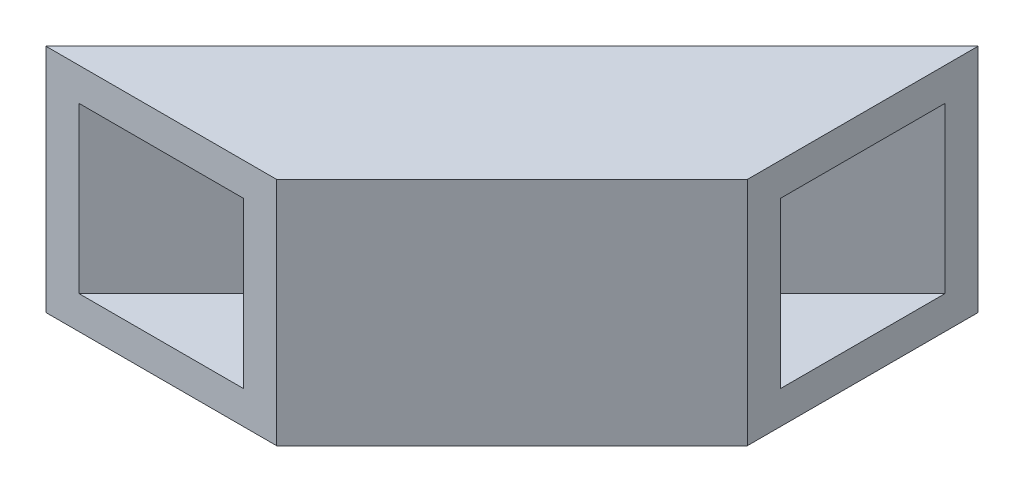
ISO-10303-21;
HEADER;
FILE_DESCRIPTION(('STEP AP214'),'2;1');
FILE_NAME('part.step','',(''),(''),'','','');
FILE_SCHEMA(('AUTOMOTIVE_DESIGN { 1 0 10303 214 1 1 1 1 }'));
ENDSEC;
DATA;
#1=APPLICATION_CONTEXT('core data for automotive mechanical design processes');
#2=APPLICATION_PROTOCOL_DEFINITION('international standard','automotive_design',2000,#1);
#3=PRODUCT_CONTEXT('',#1,'mechanical');
#4=PRODUCT('Part','Part','',(#3));
#5=PRODUCT_RELATED_PRODUCT_CATEGORY('part','',(#4));
#6=PRODUCT_DEFINITION_FORMATION('','',#4);
#7=PRODUCT_DEFINITION_CONTEXT('part definition',#1,'design');
#8=PRODUCT_DEFINITION('design','',#6,#7);
#9=PRODUCT_DEFINITION_SHAPE('','',#8);
#10=(LENGTH_UNIT() NAMED_UNIT(*) SI_UNIT(.MILLI.,.METRE.));
#11=(NAMED_UNIT(*) PLANE_ANGLE_UNIT() SI_UNIT($,.RADIAN.));
#12=(NAMED_UNIT(*) SI_UNIT($,.STERADIAN.) SOLID_ANGLE_UNIT());
#13=UNCERTAINTY_MEASURE_WITH_UNIT(LENGTH_MEASURE(1.E-05),#10,'distance_accuracy_value','');
#14=(GEOMETRIC_REPRESENTATION_CONTEXT(3) GLOBAL_UNCERTAINTY_ASSIGNED_CONTEXT((#13)) GLOBAL_UNIT_ASSIGNED_CONTEXT((#10,
#11,#12)) REPRESENTATION_CONTEXT('',''));
#15=CARTESIAN_POINT('',(0.,0.,0.));
#16=DIRECTION('',(0.,0.,1.));
#17=DIRECTION('',(1.,0.,0.));
#18=AXIS2_PLACEMENT_3D('',#15,#16,#17);
#19=CARTESIAN_POINT('',(34.9264068711931,-7.5,-42.4264068711926));
#20=DIRECTION('',(0.707106781186544,0.,0.707106781186551));
#21=DIRECTION('',(0.707106781186551,0.,-0.707106781186544));
#22=AXIS2_PLACEMENT_3D('',#19,#20,#21);
#23=PLANE('',#22);
#24=DIRECTION('',(0.,-1.,0.));
#25=VECTOR('',#24,1.);
#26=CARTESIAN_POINT('',(31.9264068711931,-7.5,-39.4264068711926));
#27=LINE('',#26,#25);
#28=CARTESIAN_POINT('',(31.9264068711931,7.5,-39.4264068711927));
#29=VERTEX_POINT('',#28);
#30=CARTESIAN_POINT('',(31.9264068711931,-7.5,-39.4264068711927));
#31=VERTEX_POINT('',#30);
#32=EDGE_CURVE('E152',#29,#31,#27,.T.);
#33=ORIENTED_EDGE('',*,*,#32,.F.);
#34=DIRECTION('',(-0.707106781186551,0.,0.707106781186544));
#35=VECTOR('',#34,1.);
#36=CARTESIAN_POINT('',(34.9264068711931,7.5,-42.4264068711926));
#37=LINE('',#36,#35);
#38=CARTESIAN_POINT('',(-7.5,7.5,0.));
#39=VERTEX_POINT('',#38);
#40=EDGE_CURVE('E132',#29,#39,#37,.T.);
#41=ORIENTED_EDGE('',*,*,#40,.T.);
#42=DIRECTION('',(0.,-1.,0.));
#43=VECTOR('',#42,1.);
#44=CARTESIAN_POINT('',(-7.5,-7.5,0.));
#45=LINE('',#44,#43);
#46=CARTESIAN_POINT('',(-7.5,-7.5,0.));
#47=VERTEX_POINT('',#46);
#48=EDGE_CURVE('E143',#39,#47,#45,.T.);
#49=ORIENTED_EDGE('',*,*,#48,.T.);
#50=DIRECTION('',(-0.707106781186551,0.,0.707106781186544));
#51=VECTOR('',#50,1.);
#52=CARTESIAN_POINT('',(34.9264068711931,-7.5,-42.4264068711926));
#53=LINE('',#52,#51);
#54=EDGE_CURVE('E155',#31,#47,#53,.T.);
#55=ORIENTED_EDGE('',*,*,#54,.F.);
#56=EDGE_LOOP('',(#33,#41,#49,#55));
#57=FACE_BOUND('',#56,.T.);
#58=ADVANCED_FACE('F43',(#57),#23,.T.);
#59=CARTESIAN_POINT('',(49.9264068711931,-7.5,-42.4264068711926));
#60=DIRECTION('',(-0.707106781186544,0.,-0.707106781186551));
#61=DIRECTION('',(-0.707106781186551,0.,0.707106781186544));
#62=AXIS2_PLACEMENT_3D('',#59,#60,#61);
#63=PLANE('',#62);
#64=DIRECTION('',(0.,1.,0.));
#65=VECTOR('',#64,1.);
#66=CARTESIAN_POINT('',(31.9264068711931,-7.5,-24.4264068711928));
#67=LINE('',#66,#65);
#68=CARTESIAN_POINT('',(31.9264068711931,-7.5,-24.4264068711928));
#69=VERTEX_POINT('',#68);
#70=CARTESIAN_POINT('',(31.9264068711931,7.5,-24.4264068711928));
#71=VERTEX_POINT('',#70);
#72=EDGE_CURVE('E11',#69,#71,#67,.T.);
#73=ORIENTED_EDGE('',*,*,#72,.F.);
#74=DIRECTION('',(-0.707106781186551,0.,0.707106781186544));
#75=VECTOR('',#74,1.);
#76=CARTESIAN_POINT('',(49.9264068711931,-7.5,-42.4264068711926));
#77=LINE('',#76,#75);
#78=CARTESIAN_POINT('',(7.5,-7.5,0.));
#79=VERTEX_POINT('',#78);
#80=EDGE_CURVE('E163',#69,#79,#77,.T.);
#81=ORIENTED_EDGE('',*,*,#80,.T.);
#82=DIRECTION('',(0.,1.,0.));
#83=VECTOR('',#82,1.);
#84=CARTESIAN_POINT('',(7.5,-7.5,0.));
#85=LINE('',#84,#83);
#86=CARTESIAN_POINT('',(7.5,7.5,0.));
#87=VERTEX_POINT('',#86);
#88=EDGE_CURVE('E140',#79,#87,#85,.T.);
#89=ORIENTED_EDGE('',*,*,#88,.T.);
#90=DIRECTION('',(-0.707106781186551,0.,0.707106781186544));
#91=VECTOR('',#90,1.);
#92=CARTESIAN_POINT('',(49.9264068711931,7.5,-42.4264068711926));
#93=LINE('',#92,#91);
#94=EDGE_CURVE('E166',#71,#87,#93,.T.);
#95=ORIENTED_EDGE('',*,*,#94,.F.);
#96=EDGE_LOOP('',(#73,#81,#89,#95));
#97=FACE_BOUND('',#96,.T.);
#98=ADVANCED_FACE('F200',(#97),#63,.T.);
#99=CARTESIAN_POINT('',(-7.5,-7.5,70.));
#100=DIRECTION('',(0.,1.,0.));
#101=DIRECTION('',(0.,0.,1.));
#102=AXIS2_PLACEMENT_3D('',#99,#100,#101);
#103=PLANE('',#102);
#104=DIRECTION('',(-1.,0.,0.));
#105=VECTOR('',#104,1.);
#106=CARTESIAN_POINT('',(-7.5,-7.5,0.));
#107=LINE('',#106,#105);
#108=EDGE_CURVE('E157',#79,#47,#107,.T.);
#109=ORIENTED_EDGE('',*,*,#108,.F.);
#110=ORIENTED_EDGE('',*,*,#80,.F.);
#111=DIRECTION('',(0.,0.,1.));
#112=VECTOR('',#111,1.);
#113=CARTESIAN_POINT('',(31.9264068711931,-7.5,70.));
#114=LINE('',#113,#112);
#115=EDGE_CURVE('E65',#31,#69,#114,.T.);
#116=ORIENTED_EDGE('',*,*,#115,.F.);
#117=ORIENTED_EDGE('',*,*,#54,.T.);
#118=EDGE_LOOP('',(#109,#110,#116,#117));
#119=FACE_BOUND('',#118,.T.);
#120=ADVANCED_FACE('F183',(#119),#103,.T.);
#121=CARTESIAN_POINT('',(-7.5,7.5,70.));
#122=DIRECTION('',(0.,-1.,0.));
#123=DIRECTION('',(0.,0.,-1.));
#124=AXIS2_PLACEMENT_3D('',#121,#122,#123);
#125=PLANE('',#124);
#126=DIRECTION('',(1.,0.,0.));
#127=VECTOR('',#126,1.);
#128=CARTESIAN_POINT('',(-7.5,7.5,0.));
#129=LINE('',#128,#127);
#130=EDGE_CURVE('E153',#39,#87,#129,.T.);
#131=ORIENTED_EDGE('',*,*,#130,.F.);
#132=ORIENTED_EDGE('',*,*,#40,.F.);
#133=DIRECTION('',(0.,0.,-1.));
#134=VECTOR('',#133,1.);
#135=CARTESIAN_POINT('',(31.9264068711931,7.5,70.));
#136=LINE('',#135,#134);
#137=EDGE_CURVE('E177',#71,#29,#136,.T.);
#138=ORIENTED_EDGE('',*,*,#137,.F.);
#139=ORIENTED_EDGE('',*,*,#94,.T.);
#140=EDGE_LOOP('',(#131,#132,#138,#139));
#141=FACE_BOUND('',#140,.T.);
#142=ADVANCED_FACE('F176',(#141),#125,.T.);
#143=CARTESIAN_POINT('',(31.9264068711931,-10.5,-42.4264068711926));
#144=DIRECTION('',(-1.,0.,0.));
#145=DIRECTION('',(0.,0.,1.));
#146=AXIS2_PLACEMENT_3D('',#143,#144,#145);
#147=PLANE('',#146);
#148=ORIENTED_EDGE('',*,*,#32,.T.);
#149=ORIENTED_EDGE('',*,*,#115,.T.);
#150=ORIENTED_EDGE('',*,*,#72,.T.);
#151=ORIENTED_EDGE('',*,*,#137,.T.);
#152=EDGE_LOOP('',(#148,#149,#150,#151));
#153=FACE_BOUND('',#152,.T.);
#154=DIRECTION('',(0.,0.,1.));
#155=VECTOR('',#154,1.);
#156=CARTESIAN_POINT('',(31.9264068711931,10.5,-42.4264068711926));
#157=LINE('',#156,#155);
#158=CARTESIAN_POINT('',(31.9264068711931,10.5,-42.4264068711926));
#159=VERTEX_POINT('',#158);
#160=CARTESIAN_POINT('',(31.9264068711931,10.5,-21.4264068711928));
#161=VERTEX_POINT('',#160);
#162=EDGE_CURVE('E58',#159,#161,#157,.T.);
#163=ORIENTED_EDGE('',*,*,#162,.T.);
#164=DIRECTION('',(0.,1.,0.));
#165=VECTOR('',#164,1.);
#166=CARTESIAN_POINT('',(31.9264068711931,-10.5,-21.4264068711928));
#167=LINE('',#166,#165);
#168=CARTESIAN_POINT('',(31.9264068711931,-10.5,-21.4264068711928));
#169=VERTEX_POINT('',#168);
#170=EDGE_CURVE('E151',#169,#161,#167,.T.);
#171=ORIENTED_EDGE('',*,*,#170,.F.);
#172=DIRECTION('',(0.,0.,1.));
#173=VECTOR('',#172,1.);
#174=CARTESIAN_POINT('',(31.9264068711931,-10.5,-42.4264068711926));
#175=LINE('',#174,#173);
#176=CARTESIAN_POINT('',(31.9264068711931,-10.5,-42.4264068711926));
#177=VERTEX_POINT('',#176);
#178=EDGE_CURVE('E187',#177,#169,#175,.T.);
#179=ORIENTED_EDGE('',*,*,#178,.F.);
#180=DIRECTION('',(0.,1.,0.));
#181=VECTOR('',#180,1.);
#182=CARTESIAN_POINT('',(31.9264068711931,-10.5,-42.4264068711926));
#183=LINE('',#182,#181);
#184=EDGE_CURVE('E128',#177,#159,#183,.T.);
#185=ORIENTED_EDGE('',*,*,#184,.T.);
#186=EDGE_LOOP('',(#163,#171,#179,#185));
#187=FACE_BOUND('',#186,.T.);
#188=ADVANCED_FACE('F189',(#153,#187),#147,.F.);
#189=CARTESIAN_POINT('',(-10.5,10.5,70.));
#190=DIRECTION('',(0.,-1.,0.));
#191=DIRECTION('',(0.,0.,-1.));
#192=AXIS2_PLACEMENT_3D('',#189,#190,#191);
#193=PLANE('',#192);
#194=DIRECTION('',(-0.707106781186551,0.,0.707106781186544));
#195=VECTOR('',#194,1.);
#196=CARTESIAN_POINT('',(31.9264068711931,10.5,-42.4264068711926));
#197=LINE('',#196,#195);
#198=CARTESIAN_POINT('',(-10.5,10.5,0.));
#199=VERTEX_POINT('',#198);
#200=EDGE_CURVE('E138',#159,#199,#197,.T.);
#201=ORIENTED_EDGE('',*,*,#200,.T.);
#202=DIRECTION('',(-1.,0.,0.));
#203=VECTOR('',#202,1.);
#204=CARTESIAN_POINT('',(-10.5,10.5,0.));
#205=LINE('',#204,#203);
#206=CARTESIAN_POINT('',(10.5,10.5,0.));
#207=VERTEX_POINT('',#206);
#208=EDGE_CURVE('E111',#207,#199,#205,.T.);
#209=ORIENTED_EDGE('',*,*,#208,.F.);
#210=DIRECTION('',(-0.707106781186551,0.,0.707106781186544));
#211=VECTOR('',#210,1.);
#212=CARTESIAN_POINT('',(52.9264068711931,10.5,-42.4264068711926));
#213=LINE('',#212,#211);
#214=EDGE_CURVE('E130',#161,#207,#213,.T.);
#215=ORIENTED_EDGE('',*,*,#214,.F.);
#216=ORIENTED_EDGE('',*,*,#162,.F.);
#217=EDGE_LOOP('',(#201,#209,#215,#216));
#218=FACE_BOUND('',#217,.T.);
#219=ADVANCED_FACE('F45',(#218),#193,.F.);
#220=CARTESIAN_POINT('',(-10.5,-10.5,70.));
#221=DIRECTION('',(0.,1.,0.));
#222=DIRECTION('',(0.,0.,1.));
#223=AXIS2_PLACEMENT_3D('',#220,#221,#222);
#224=PLANE('',#223);
#225=DIRECTION('',(-0.707106781186551,0.,0.707106781186544));
#226=VECTOR('',#225,1.);
#227=CARTESIAN_POINT('',(52.9264068711931,-10.5,-42.4264068711926));
#228=LINE('',#227,#226);
#229=CARTESIAN_POINT('',(10.5,-10.5,0.));
#230=VERTEX_POINT('',#229);
#231=EDGE_CURVE('E124',#169,#230,#228,.T.);
#232=ORIENTED_EDGE('',*,*,#231,.T.);
#233=DIRECTION('',(-1.,0.,0.));
#234=VECTOR('',#233,1.);
#235=CARTESIAN_POINT('',(-10.5,-10.5,0.));
#236=LINE('',#235,#234);
#237=CARTESIAN_POINT('',(-10.5,-10.5,0.));
#238=VERTEX_POINT('',#237);
#239=EDGE_CURVE('E108',#230,#238,#236,.T.);
#240=ORIENTED_EDGE('',*,*,#239,.T.);
#241=DIRECTION('',(-0.707106781186551,0.,0.707106781186544));
#242=VECTOR('',#241,1.);
#243=CARTESIAN_POINT('',(31.9264068711931,-10.5,-42.4264068711926));
#244=LINE('',#243,#242);
#245=EDGE_CURVE('E121',#177,#238,#244,.T.);
#246=ORIENTED_EDGE('',*,*,#245,.F.);
#247=ORIENTED_EDGE('',*,*,#178,.T.);
#248=EDGE_LOOP('',(#232,#240,#246,#247));
#249=FACE_BOUND('',#248,.T.);
#250=ADVANCED_FACE('F119',(#249),#224,.F.);
#251=CARTESIAN_POINT('',(31.9264068711931,-10.5,-42.4264068711926));
#252=DIRECTION('',(0.707106781186544,0.,0.707106781186551));
#253=DIRECTION('',(0.707106781186551,0.,-0.707106781186544));
#254=AXIS2_PLACEMENT_3D('',#251,#252,#253);
#255=PLANE('',#254);
#256=DIRECTION('',(0.,-1.,0.));
#257=VECTOR('',#256,1.);
#258=CARTESIAN_POINT('',(-10.5,-10.5,0.));
#259=LINE('',#258,#257);
#260=EDGE_CURVE('E51',#199,#238,#259,.T.);
#261=ORIENTED_EDGE('',*,*,#260,.F.);
#262=ORIENTED_EDGE('',*,*,#200,.F.);
#263=ORIENTED_EDGE('',*,*,#184,.F.);
#264=ORIENTED_EDGE('',*,*,#245,.T.);
#265=EDGE_LOOP('',(#261,#262,#263,#264));
#266=FACE_BOUND('',#265,.T.);
#267=ADVANCED_FACE('F127',(#266),#255,.F.);
#268=CARTESIAN_POINT('',(52.9264068711931,-10.5,-42.4264068711926));
#269=DIRECTION('',(-0.707106781186544,0.,-0.707106781186551));
#270=DIRECTION('',(-0.707106781186551,0.,0.707106781186544));
#271=AXIS2_PLACEMENT_3D('',#268,#269,#270);
#272=PLANE('',#271);
#273=ORIENTED_EDGE('',*,*,#231,.F.);
#274=ORIENTED_EDGE('',*,*,#170,.T.);
#275=ORIENTED_EDGE('',*,*,#214,.T.);
#276=DIRECTION('',(0.,1.,0.));
#277=VECTOR('',#276,1.);
#278=CARTESIAN_POINT('',(10.5,-10.5,0.));
#279=LINE('',#278,#277);
#280=EDGE_CURVE('E116',#230,#207,#279,.T.);
#281=ORIENTED_EDGE('',*,*,#280,.F.);
#282=EDGE_LOOP('',(#273,#274,#275,#281));
#283=FACE_BOUND('',#282,.T.);
#284=ADVANCED_FACE('F150',(#283),#272,.F.);
#285=CARTESIAN_POINT('',(-10.5,-10.5,0.));
#286=DIRECTION('',(0.,0.,-1.));
#287=DIRECTION('',(-1.,0.,0.));
#288=AXIS2_PLACEMENT_3D('',#285,#286,#287);
#289=PLANE('',#288);
#290=ORIENTED_EDGE('',*,*,#130,.T.);
#291=ORIENTED_EDGE('',*,*,#88,.F.);
#292=ORIENTED_EDGE('',*,*,#108,.T.);
#293=ORIENTED_EDGE('',*,*,#48,.F.);
#294=EDGE_LOOP('',(#290,#291,#292,#293));
#295=FACE_BOUND('',#294,.T.);
#296=ORIENTED_EDGE('',*,*,#208,.T.);
#297=ORIENTED_EDGE('',*,*,#260,.T.);
#298=ORIENTED_EDGE('',*,*,#239,.F.);
#299=ORIENTED_EDGE('',*,*,#280,.T.);
#300=EDGE_LOOP('',(#296,#297,#298,#299));
#301=FACE_BOUND('',#300,.T.);
#302=ADVANCED_FACE('F107',(#295,#301),#289,.F.);
#303=CLOSED_SHELL('',(#58,#98,#120,#142,#188,#219,#250,#267,#284,#302));
#304=MANIFOLD_SOLID_BREP('B2',#303);
#305=ADVANCED_BREP_SHAPE_REPRESENTATION('',(#18,#304),#14);
#306=SHAPE_DEFINITION_REPRESENTATION(#9,#305);
ENDSEC;
END-ISO-10303-21;
